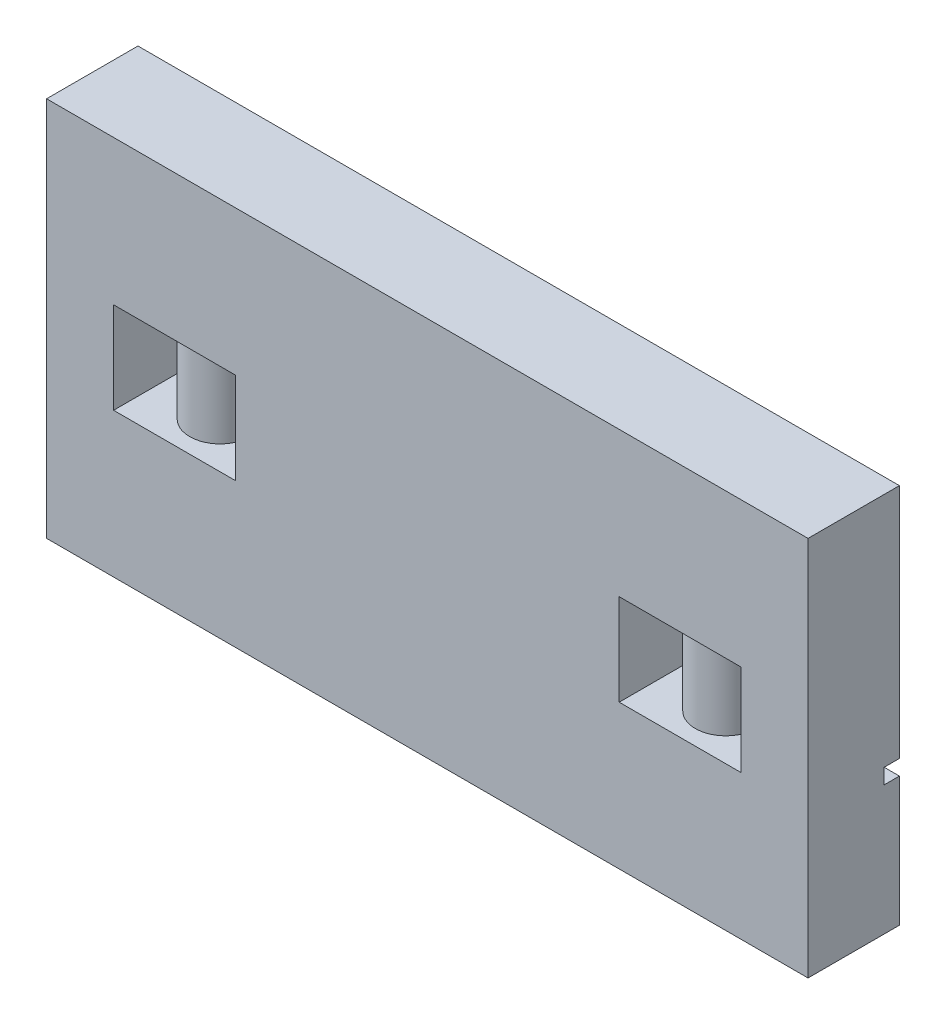
ISO-10303-21;
HEADER;
FILE_DESCRIPTION(('STEP AP214'),'2;1');
FILE_NAME('part.step','',(''),(''),'','','');
FILE_SCHEMA(('AUTOMOTIVE_DESIGN { 1 0 10303 214 1 1 1 1 }'));
ENDSEC;
DATA;
#1=APPLICATION_CONTEXT('core data for automotive mechanical design processes');
#2=APPLICATION_PROTOCOL_DEFINITION('international standard','automotive_design',2000,#1);
#3=PRODUCT_CONTEXT('',#1,'mechanical');
#4=PRODUCT('Part','Part','',(#3));
#5=PRODUCT_RELATED_PRODUCT_CATEGORY('part','',(#4));
#6=PRODUCT_DEFINITION_FORMATION('','',#4);
#7=PRODUCT_DEFINITION_CONTEXT('part definition',#1,'design');
#8=PRODUCT_DEFINITION('design','',#6,#7);
#9=PRODUCT_DEFINITION_SHAPE('','',#8);
#10=(LENGTH_UNIT() NAMED_UNIT(*) SI_UNIT(.MILLI.,.METRE.));
#11=(NAMED_UNIT(*) PLANE_ANGLE_UNIT() SI_UNIT($,.RADIAN.));
#12=(NAMED_UNIT(*) SI_UNIT($,.STERADIAN.) SOLID_ANGLE_UNIT());
#13=UNCERTAINTY_MEASURE_WITH_UNIT(LENGTH_MEASURE(1.E-05),#10,'distance_accuracy_value','');
#14=(GEOMETRIC_REPRESENTATION_CONTEXT(3) GLOBAL_UNCERTAINTY_ASSIGNED_CONTEXT((#13)) GLOBAL_UNIT_ASSIGNED_CONTEXT((#10,
#11,#12)) REPRESENTATION_CONTEXT('',''));
#15=CARTESIAN_POINT('',(0.,0.,0.));
#16=DIRECTION('',(0.,0.,1.));
#17=DIRECTION('',(1.,0.,0.));
#18=AXIS2_PLACEMENT_3D('',#15,#16,#17);
#19=CARTESIAN_POINT('',(0.,0.,60.));
#20=DIRECTION('',(0.,0.,1.));
#21=DIRECTION('',(1.,0.,0.));
#22=AXIS2_PLACEMENT_3D('',#19,#20,#21);
#23=PLANE('',#22);
#24=DIRECTION('',(0.,-1.,0.));
#25=VECTOR('',#24,1.);
#26=CARTESIAN_POINT('',(0.,250.,60.));
#27=LINE('',#26,#25);
#28=CARTESIAN_POINT('',(0.,250.,60.));
#29=VERTEX_POINT('',#28);
#30=CARTESIAN_POINT('',(0.,0.,60.));
#31=VERTEX_POINT('',#30);
#32=EDGE_CURVE('E289',#29,#31,#27,.T.);
#33=ORIENTED_EDGE('',*,*,#32,.T.);
#34=DIRECTION('',(1.,0.,0.));
#35=VECTOR('',#34,1.);
#36=CARTESIAN_POINT('',(0.,0.,60.));
#37=LINE('',#36,#35);
#38=CARTESIAN_POINT('',(500.,0.,60.));
#39=VERTEX_POINT('',#38);
#40=EDGE_CURVE('E288',#31,#39,#37,.T.);
#41=ORIENTED_EDGE('',*,*,#40,.T.);
#42=DIRECTION('',(0.,1.,0.));
#43=VECTOR('',#42,1.);
#44=CARTESIAN_POINT('',(500.,0.,60.));
#45=LINE('',#44,#43);
#46=CARTESIAN_POINT('',(500.,250.,60.));
#47=VERTEX_POINT('',#46);
#48=EDGE_CURVE('E291',#39,#47,#45,.T.);
#49=ORIENTED_EDGE('',*,*,#48,.T.);
#50=DIRECTION('',(-1.,0.,0.));
#51=VECTOR('',#50,1.);
#52=CARTESIAN_POINT('',(500.,250.,60.));
#53=LINE('',#52,#51);
#54=EDGE_CURVE('E293',#47,#29,#53,.T.);
#55=ORIENTED_EDGE('',*,*,#54,.T.);
#56=EDGE_LOOP('',(#33,#41,#49,#55));
#57=FACE_BOUND('',#56,.T.);
#58=DIRECTION('',(0.,-1.,0.));
#59=VECTOR('',#58,1.);
#60=CARTESIAN_POINT('',(44.,154.842468298091,60.));
#61=LINE('',#60,#59);
#62=CARTESIAN_POINT('',(44.,154.842468298091,60.));
#63=VERTEX_POINT('',#62);
#64=CARTESIAN_POINT('',(44.,94.8424682980915,60.));
#65=VERTEX_POINT('',#64);
#66=EDGE_CURVE('E222',#63,#65,#61,.T.);
#67=ORIENTED_EDGE('',*,*,#66,.F.);
#68=DIRECTION('',(-1.,0.,0.));
#69=VECTOR('',#68,1.);
#70=CARTESIAN_POINT('',(500.,154.842468298091,59.9999999999999));
#71=LINE('',#70,#69);
#72=CARTESIAN_POINT('',(124.,154.842468298091,60.));
#73=VERTEX_POINT('',#72);
#74=EDGE_CURVE('E237',#73,#63,#71,.T.);
#75=ORIENTED_EDGE('',*,*,#74,.F.);
#76=DIRECTION('',(0.,-1.,0.));
#77=VECTOR('',#76,1.);
#78=CARTESIAN_POINT('',(124.,154.842468298091,60.));
#79=LINE('',#78,#77);
#80=CARTESIAN_POINT('',(124.,94.8424682980915,60.));
#81=VERTEX_POINT('',#80);
#82=EDGE_CURVE('E229',#73,#81,#79,.T.);
#83=ORIENTED_EDGE('',*,*,#82,.T.);
#84=DIRECTION('',(-1.,0.,0.));
#85=VECTOR('',#84,1.);
#86=CARTESIAN_POINT('',(500.,94.8424682980915,59.9999999999999));
#87=LINE('',#86,#85);
#88=EDGE_CURVE('E234',#81,#65,#87,.T.);
#89=ORIENTED_EDGE('',*,*,#88,.T.);
#90=EDGE_LOOP('',(#67,#75,#83,#89));
#91=FACE_BOUND('',#90,.T.);
#92=DIRECTION('',(0.,-1.,0.));
#93=VECTOR('',#92,1.);
#94=CARTESIAN_POINT('',(376.,154.842468298091,60.));
#95=LINE('',#94,#93);
#96=CARTESIAN_POINT('',(376.,154.842468298091,60.));
#97=VERTEX_POINT('',#96);
#98=CARTESIAN_POINT('',(376.,94.8424682980915,60.));
#99=VERTEX_POINT('',#98);
#100=EDGE_CURVE('E212',#97,#99,#95,.T.);
#101=ORIENTED_EDGE('',*,*,#100,.F.);
#102=DIRECTION('',(-1.,0.,0.));
#103=VECTOR('',#102,1.);
#104=CARTESIAN_POINT('',(500.,154.842468298091,60.));
#105=LINE('',#104,#103);
#106=CARTESIAN_POINT('',(456.,154.842468298091,60.));
#107=VERTEX_POINT('',#106);
#108=EDGE_CURVE('E186',#107,#97,#105,.T.);
#109=ORIENTED_EDGE('',*,*,#108,.F.);
#110=DIRECTION('',(0.,-1.,0.));
#111=VECTOR('',#110,1.);
#112=CARTESIAN_POINT('',(456.,154.842468298091,60.));
#113=LINE('',#112,#111);
#114=CARTESIAN_POINT('',(456.,94.8424682980915,60.));
#115=VERTEX_POINT('',#114);
#116=EDGE_CURVE('E220',#107,#115,#113,.T.);
#117=ORIENTED_EDGE('',*,*,#116,.T.);
#118=DIRECTION('',(-1.,0.,0.));
#119=VECTOR('',#118,1.);
#120=CARTESIAN_POINT('',(500.,94.8424682980915,60.0000000000001));
#121=LINE('',#120,#119);
#122=EDGE_CURVE('E197',#115,#99,#121,.T.);
#123=ORIENTED_EDGE('',*,*,#122,.T.);
#124=EDGE_LOOP('',(#101,#109,#117,#123));
#125=FACE_BOUND('',#124,.T.);
#126=ADVANCED_FACE('F43',(#57,#91,#125),#23,.T.);
#127=CARTESIAN_POINT('',(500.,94.8424682980915,0.));
#128=DIRECTION('',(0.,-1.,0.));
#129=DIRECTION('',(0.,0.,-1.));
#130=AXIS2_PLACEMENT_3D('',#127,#128,#129);
#131=PLANE('',#130);
#132=DIRECTION('',(0.,0.,-1.));
#133=VECTOR('',#132,1.);
#134=CARTESIAN_POINT('',(376.,94.8424682980915,0.));
#135=LINE('',#134,#133);
#136=CARTESIAN_POINT('',(376.,94.8424682980915,10.));
#137=VERTEX_POINT('',#136);
#138=CARTESIAN_POINT('',(376.,94.8424682980915,0.));
#139=VERTEX_POINT('',#138);
#140=EDGE_CURVE('E185',#137,#139,#135,.T.);
#141=ORIENTED_EDGE('',*,*,#140,.F.);
#142=DIRECTION('',(-1.,0.,0.));
#143=VECTOR('',#142,1.);
#144=CARTESIAN_POINT('',(500.,94.8424682980915,10.));
#145=LINE('',#144,#143);
#146=CARTESIAN_POINT('',(124.,94.8424682980915,10.));
#147=VERTEX_POINT('',#146);
#148=EDGE_CURVE('E407',#137,#147,#145,.T.);
#149=ORIENTED_EDGE('',*,*,#148,.T.);
#150=DIRECTION('',(0.,0.,1.));
#151=VECTOR('',#150,1.);
#152=CARTESIAN_POINT('',(124.,94.8424682980915,0.));
#153=LINE('',#152,#151);
#154=CARTESIAN_POINT('',(124.,94.8424682980915,0.));
#155=VERTEX_POINT('',#154);
#156=EDGE_CURVE('E240',#155,#147,#153,.T.);
#157=ORIENTED_EDGE('',*,*,#156,.F.);
#158=DIRECTION('',(-1.,0.,0.));
#159=VECTOR('',#158,1.);
#160=CARTESIAN_POINT('',(500.,94.8424682980915,0.));
#161=LINE('',#160,#159);
#162=EDGE_CURVE('E287',#139,#155,#161,.T.);
#163=ORIENTED_EDGE('',*,*,#162,.F.);
#164=EDGE_LOOP('',(#141,#149,#157,#163));
#165=FACE_BOUND('',#164,.T.);
#166=ADVANCED_FACE('F361',(#165),#131,.T.);
#167=DIRECTION('',(0.,0.,1.));
#168=VECTOR('',#167,1.);
#169=CARTESIAN_POINT('',(456.,94.8424682980915,0.));
#170=LINE('',#169,#168);
#171=CARTESIAN_POINT('',(456.,94.8424682980915,0.));
#172=VERTEX_POINT('',#171);
#173=CARTESIAN_POINT('',(456.,94.8424682980915,10.));
#174=VERTEX_POINT('',#173);
#175=EDGE_CURVE('E207',#172,#174,#170,.T.);
#176=ORIENTED_EDGE('',*,*,#175,.F.);
#177=CARTESIAN_POINT('',(500.,94.8424682980915,0.));
#178=VERTEX_POINT('',#177);
#179=EDGE_CURVE('E281',#178,#172,#161,.T.);
#180=ORIENTED_EDGE('',*,*,#179,.F.);
#181=DIRECTION('',(0.,0.,1.));
#182=VECTOR('',#181,1.);
#183=CARTESIAN_POINT('',(500.,94.8424682980915,0.));
#184=LINE('',#183,#182);
#185=CARTESIAN_POINT('',(500.,94.8424682980915,10.));
#186=VERTEX_POINT('',#185);
#187=EDGE_CURVE('E259',#178,#186,#184,.T.);
#188=ORIENTED_EDGE('',*,*,#187,.T.);
#189=EDGE_CURVE('E279',#186,#174,#145,.T.);
#190=ORIENTED_EDGE('',*,*,#189,.T.);
#191=EDGE_LOOP('',(#176,#180,#188,#190));
#192=FACE_BOUND('',#191,.T.);
#193=ADVANCED_FACE('F369',(#192),#131,.T.);
#194=CARTESIAN_POINT('',(0.,250.,60.));
#195=DIRECTION('',(1.,0.,0.));
#196=DIRECTION('',(0.,0.,-1.));
#197=AXIS2_PLACEMENT_3D('',#194,#195,#196);
#198=PLANE('',#197);
#199=DIRECTION('',(0.,0.,1.));
#200=VECTOR('',#199,1.);
#201=CARTESIAN_POINT('',(0.,94.8424682980915,0.));
#202=LINE('',#201,#200);
#203=CARTESIAN_POINT('',(0.,94.8424682980915,0.));
#204=VERTEX_POINT('',#203);
#205=CARTESIAN_POINT('',(0.,94.8424682980915,10.));
#206=VERTEX_POINT('',#205);
#207=EDGE_CURVE('E216',#204,#206,#202,.T.);
#208=ORIENTED_EDGE('',*,*,#207,.T.);
#209=DIRECTION('',(0.,-1.,0.));
#210=VECTOR('',#209,1.);
#211=CARTESIAN_POINT('',(0.,94.8424682980915,10.));
#212=LINE('',#211,#210);
#213=CARTESIAN_POINT('',(0.,84.8424682980915,10.));
#214=VERTEX_POINT('',#213);
#215=EDGE_CURVE('E267',#206,#214,#212,.T.);
#216=ORIENTED_EDGE('',*,*,#215,.T.);
#217=DIRECTION('',(0.,0.,-1.));
#218=VECTOR('',#217,1.);
#219=CARTESIAN_POINT('',(0.,84.8424682980915,10.));
#220=LINE('',#219,#218);
#221=CARTESIAN_POINT('',(0.,84.8424682980915,0.));
#222=VERTEX_POINT('',#221);
#223=EDGE_CURVE('E265',#214,#222,#220,.T.);
#224=ORIENTED_EDGE('',*,*,#223,.T.);
#225=DIRECTION('',(0.,-1.,0.));
#226=VECTOR('',#225,1.);
#227=CARTESIAN_POINT('',(0.,250.,0.));
#228=LINE('',#227,#226);
#229=CARTESIAN_POINT('',(0.,0.,0.));
#230=VERTEX_POINT('',#229);
#231=EDGE_CURVE('E282',#222,#230,#228,.T.);
#232=ORIENTED_EDGE('',*,*,#231,.T.);
#233=DIRECTION('',(0.,0.,-1.));
#234=VECTOR('',#233,1.);
#235=CARTESIAN_POINT('',(0.,0.,60.));
#236=LINE('',#235,#234);
#237=EDGE_CURVE('E11',#31,#230,#236,.T.);
#238=ORIENTED_EDGE('',*,*,#237,.F.);
#239=ORIENTED_EDGE('',*,*,#32,.F.);
#240=DIRECTION('',(0.,0.,-1.));
#241=VECTOR('',#240,1.);
#242=CARTESIAN_POINT('',(0.,250.,60.));
#243=LINE('',#242,#241);
#244=CARTESIAN_POINT('',(0.,250.,0.));
#245=VERTEX_POINT('',#244);
#246=EDGE_CURVE('E300',#29,#245,#243,.T.);
#247=ORIENTED_EDGE('',*,*,#246,.T.);
#248=EDGE_CURVE('E296',#245,#204,#228,.T.);
#249=ORIENTED_EDGE('',*,*,#248,.T.);
#250=EDGE_LOOP('',(#208,#216,#224,#232,#238,#239,#247,#249));
#251=FACE_BOUND('',#250,.T.);
#252=ADVANCED_FACE('F44',(#251),#198,.F.);
#253=CARTESIAN_POINT('',(500.,0.,60.));
#254=DIRECTION('',(-1.,0.,0.));
#255=DIRECTION('',(0.,0.,1.));
#256=AXIS2_PLACEMENT_3D('',#253,#254,#255);
#257=PLANE('',#256);
#258=ORIENTED_EDGE('',*,*,#187,.F.);
#259=DIRECTION('',(0.,1.,0.));
#260=VECTOR('',#259,1.);
#261=CARTESIAN_POINT('',(500.,0.,0.));
#262=LINE('',#261,#260);
#263=CARTESIAN_POINT('',(500.,250.,0.));
#264=VERTEX_POINT('',#263);
#265=EDGE_CURVE('E305',#178,#264,#262,.T.);
#266=ORIENTED_EDGE('',*,*,#265,.T.);
#267=DIRECTION('',(0.,0.,-1.));
#268=VECTOR('',#267,1.);
#269=CARTESIAN_POINT('',(500.,250.,60.));
#270=LINE('',#269,#268);
#271=EDGE_CURVE('E309',#47,#264,#270,.T.);
#272=ORIENTED_EDGE('',*,*,#271,.F.);
#273=ORIENTED_EDGE('',*,*,#48,.F.);
#274=DIRECTION('',(0.,0.,-1.));
#275=VECTOR('',#274,1.);
#276=CARTESIAN_POINT('',(500.,0.,60.));
#277=LINE('',#276,#275);
#278=CARTESIAN_POINT('',(500.,0.,0.));
#279=VERTEX_POINT('',#278);
#280=EDGE_CURVE('E51',#39,#279,#277,.T.);
#281=ORIENTED_EDGE('',*,*,#280,.T.);
#282=CARTESIAN_POINT('',(500.,84.8424682980915,0.));
#283=VERTEX_POINT('',#282);
#284=EDGE_CURVE('E301',#279,#283,#262,.T.);
#285=ORIENTED_EDGE('',*,*,#284,.T.);
#286=DIRECTION('',(0.,0.,-1.));
#287=VECTOR('',#286,1.);
#288=CARTESIAN_POINT('',(500.,84.8424682980915,10.));
#289=LINE('',#288,#287);
#290=CARTESIAN_POINT('',(500.,84.8424682980915,10.));
#291=VERTEX_POINT('',#290);
#292=EDGE_CURVE('E262',#291,#283,#289,.T.);
#293=ORIENTED_EDGE('',*,*,#292,.F.);
#294=DIRECTION('',(0.,-1.,0.));
#295=VECTOR('',#294,1.);
#296=CARTESIAN_POINT('',(500.,94.8424682980915,10.));
#297=LINE('',#296,#295);
#298=EDGE_CURVE('E261',#186,#291,#297,.T.);
#299=ORIENTED_EDGE('',*,*,#298,.F.);
#300=EDGE_LOOP('',(#258,#266,#272,#273,#281,#285,#293,#299));
#301=FACE_BOUND('',#300,.T.);
#302=ADVANCED_FACE('F318',(#301),#257,.F.);
#303=CARTESIAN_POINT('',(0.,0.,0.));
#304=DIRECTION('',(0.,0.,1.));
#305=DIRECTION('',(1.,0.,0.));
#306=AXIS2_PLACEMENT_3D('',#303,#304,#305);
#307=PLANE('',#306);
#308=DIRECTION('',(1.,0.,0.));
#309=VECTOR('',#308,1.);
#310=CARTESIAN_POINT('',(500.,154.842468298091,0.));
#311=LINE('',#310,#309);
#312=CARTESIAN_POINT('',(376.,154.842468298091,0.));
#313=VERTEX_POINT('',#312);
#314=CARTESIAN_POINT('',(456.,154.842468298091,0.));
#315=VERTEX_POINT('',#314);
#316=EDGE_CURVE('E191',#313,#315,#311,.T.);
#317=ORIENTED_EDGE('',*,*,#316,.F.);
#318=DIRECTION('',(0.,-1.,0.));
#319=VECTOR('',#318,1.);
#320=CARTESIAN_POINT('',(376.,154.842468298091,0.));
#321=LINE('',#320,#319);
#322=EDGE_CURVE('E177',#313,#139,#321,.T.);
#323=ORIENTED_EDGE('',*,*,#322,.T.);
#324=ORIENTED_EDGE('',*,*,#162,.T.);
#325=DIRECTION('',(0.,-1.,0.));
#326=VECTOR('',#325,1.);
#327=CARTESIAN_POINT('',(124.,154.842468298091,0.));
#328=LINE('',#327,#326);
#329=CARTESIAN_POINT('',(124.,154.842468298091,0.));
#330=VERTEX_POINT('',#329);
#331=EDGE_CURVE('E230',#330,#155,#328,.T.);
#332=ORIENTED_EDGE('',*,*,#331,.F.);
#333=DIRECTION('',(1.,0.,0.));
#334=VECTOR('',#333,1.);
#335=CARTESIAN_POINT('',(500.,154.842468298091,0.));
#336=LINE('',#335,#334);
#337=CARTESIAN_POINT('',(44.,154.842468298091,0.));
#338=VERTEX_POINT('',#337);
#339=EDGE_CURVE('E242',#338,#330,#336,.T.);
#340=ORIENTED_EDGE('',*,*,#339,.F.);
#341=DIRECTION('',(0.,-1.,0.));
#342=VECTOR('',#341,1.);
#343=CARTESIAN_POINT('',(44.,154.842468298091,0.));
#344=LINE('',#343,#342);
#345=CARTESIAN_POINT('',(44.,94.8424682980915,0.));
#346=VERTEX_POINT('',#345);
#347=EDGE_CURVE('E221',#338,#346,#344,.T.);
#348=ORIENTED_EDGE('',*,*,#347,.T.);
#349=EDGE_CURVE('E283',#346,#204,#161,.T.);
#350=ORIENTED_EDGE('',*,*,#349,.T.);
#351=ORIENTED_EDGE('',*,*,#248,.F.);
#352=DIRECTION('',(-1.,0.,0.));
#353=VECTOR('',#352,1.);
#354=CARTESIAN_POINT('',(500.,250.,0.));
#355=LINE('',#354,#353);
#356=EDGE_CURVE('E292',#264,#245,#355,.T.);
#357=ORIENTED_EDGE('',*,*,#356,.F.);
#358=ORIENTED_EDGE('',*,*,#265,.F.);
#359=ORIENTED_EDGE('',*,*,#179,.T.);
#360=DIRECTION('',(0.,-1.,0.));
#361=VECTOR('',#360,1.);
#362=CARTESIAN_POINT('',(456.,154.842468298091,0.));
#363=LINE('',#362,#361);
#364=EDGE_CURVE('E190',#315,#172,#363,.T.);
#365=ORIENTED_EDGE('',*,*,#364,.F.);
#366=EDGE_LOOP('',(#317,#323,#324,#332,#340,#348,#350,#351,#357,#358,#359,#365));
#367=FACE_BOUND('',#366,.T.);
#368=ADVANCED_FACE('F200',(#367),#307,.F.);
#369=DIRECTION('',(-1.,0.,0.));
#370=VECTOR('',#369,1.);
#371=CARTESIAN_POINT('',(500.,84.8424682980915,0.));
#372=LINE('',#371,#370);
#373=EDGE_CURVE('E266',#283,#222,#372,.T.);
#374=ORIENTED_EDGE('',*,*,#373,.F.);
#375=ORIENTED_EDGE('',*,*,#284,.F.);
#376=DIRECTION('',(1.,0.,0.));
#377=VECTOR('',#376,1.);
#378=CARTESIAN_POINT('',(0.,0.,0.));
#379=LINE('',#378,#377);
#380=EDGE_CURVE('E302',#230,#279,#379,.T.);
#381=ORIENTED_EDGE('',*,*,#380,.F.);
#382=ORIENTED_EDGE('',*,*,#231,.F.);
#383=EDGE_LOOP('',(#374,#375,#381,#382));
#384=FACE_BOUND('',#383,.T.);
#385=ADVANCED_FACE('F324',(#384),#307,.F.);
#386=CARTESIAN_POINT('',(0.,0.,60.));
#387=DIRECTION('',(0.,1.,0.));
#388=DIRECTION('',(0.,0.,1.));
#389=AXIS2_PLACEMENT_3D('',#386,#387,#388);
#390=PLANE('',#389);
#391=ORIENTED_EDGE('',*,*,#380,.T.);
#392=ORIENTED_EDGE('',*,*,#280,.F.);
#393=ORIENTED_EDGE('',*,*,#40,.F.);
#394=ORIENTED_EDGE('',*,*,#237,.T.);
#395=EDGE_LOOP('',(#391,#392,#393,#394));
#396=FACE_BOUND('',#395,.T.);
#397=ADVANCED_FACE('F355',(#396),#390,.F.);
#398=CARTESIAN_POINT('',(500.,250.,60.));
#399=DIRECTION('',(0.,-1.,0.));
#400=DIRECTION('',(0.,0.,-1.));
#401=AXIS2_PLACEMENT_3D('',#398,#399,#400);
#402=PLANE('',#401);
#403=ORIENTED_EDGE('',*,*,#356,.T.);
#404=ORIENTED_EDGE('',*,*,#246,.F.);
#405=ORIENTED_EDGE('',*,*,#54,.F.);
#406=ORIENTED_EDGE('',*,*,#271,.T.);
#407=EDGE_LOOP('',(#403,#404,#405,#406));
#408=FACE_BOUND('',#407,.T.);
#409=ADVANCED_FACE('F350',(#408),#402,.F.);
#410=DIRECTION('',(0.,0.,-1.));
#411=VECTOR('',#410,1.);
#412=CARTESIAN_POINT('',(44.,94.8424682980915,0.));
#413=LINE('',#412,#411);
#414=CARTESIAN_POINT('',(44.,94.8424682980915,10.));
#415=VERTEX_POINT('',#414);
#416=EDGE_CURVE('E238',#415,#346,#413,.T.);
#417=ORIENTED_EDGE('',*,*,#416,.F.);
#418=EDGE_CURVE('E280',#415,#206,#145,.T.);
#419=ORIENTED_EDGE('',*,*,#418,.T.);
#420=ORIENTED_EDGE('',*,*,#207,.F.);
#421=ORIENTED_EDGE('',*,*,#349,.F.);
#422=EDGE_LOOP('',(#417,#419,#420,#421));
#423=FACE_BOUND('',#422,.T.);
#424=ADVANCED_FACE('F359',(#423),#131,.T.);
#425=CARTESIAN_POINT('',(500.,94.8424682980915,10.));
#426=DIRECTION('',(0.,0.,-1.));
#427=DIRECTION('',(-1.,0.,0.));
#428=AXIS2_PLACEMENT_3D('',#425,#426,#427);
#429=PLANE('',#428);
#430=ORIENTED_EDGE('',*,*,#215,.F.);
#431=ORIENTED_EDGE('',*,*,#418,.F.);
#432=CARTESIAN_POINT('',(84.,94.8424682980915,10.));
#433=VERTEX_POINT('',#432);
#434=EDGE_CURVE('E412',#433,#415,#145,.T.);
#435=ORIENTED_EDGE('',*,*,#434,.F.);
#436=EDGE_CURVE('E401',#147,#433,#145,.T.);
#437=ORIENTED_EDGE('',*,*,#436,.F.);
#438=ORIENTED_EDGE('',*,*,#148,.F.);
#439=CARTESIAN_POINT('',(416.,94.8424682980915,10.));
#440=VERTEX_POINT('',#439);
#441=EDGE_CURVE('E414',#440,#137,#145,.T.);
#442=ORIENTED_EDGE('',*,*,#441,.F.);
#443=EDGE_CURVE('E285',#174,#440,#145,.T.);
#444=ORIENTED_EDGE('',*,*,#443,.F.);
#445=ORIENTED_EDGE('',*,*,#189,.F.);
#446=ORIENTED_EDGE('',*,*,#298,.T.);
#447=DIRECTION('',(-1.,0.,0.));
#448=VECTOR('',#447,1.);
#449=CARTESIAN_POINT('',(500.,84.8424682980915,10.));
#450=LINE('',#449,#448);
#451=EDGE_CURVE('E274',#291,#214,#450,.T.);
#452=ORIENTED_EDGE('',*,*,#451,.T.);
#453=EDGE_LOOP('',(#430,#431,#435,#437,#438,#442,#444,#445,#446,#452));
#454=FACE_BOUND('',#453,.T.);
#455=ADVANCED_FACE('F340',(#454),#429,.T.);
#456=CARTESIAN_POINT('',(500.,84.8424682980915,10.));
#457=DIRECTION('',(0.,1.,0.));
#458=DIRECTION('',(0.,0.,1.));
#459=AXIS2_PLACEMENT_3D('',#456,#457,#458);
#460=PLANE('',#459);
#461=ORIENTED_EDGE('',*,*,#223,.F.);
#462=ORIENTED_EDGE('',*,*,#451,.F.);
#463=ORIENTED_EDGE('',*,*,#292,.T.);
#464=ORIENTED_EDGE('',*,*,#373,.T.);
#465=EDGE_LOOP('',(#461,#462,#463,#464));
#466=FACE_BOUND('',#465,.T.);
#467=ADVANCED_FACE('F328',(#466),#460,.T.);
#468=CARTESIAN_POINT('',(124.,154.842468298091,0.));
#469=DIRECTION('',(1.,0.,0.));
#470=DIRECTION('',(0.,0.,-1.));
#471=AXIS2_PLACEMENT_3D('',#468,#469,#470);
#472=PLANE('',#471);
#473=ORIENTED_EDGE('',*,*,#156,.T.);
#474=EDGE_CURVE('E233',#147,#81,#153,.T.);
#475=ORIENTED_EDGE('',*,*,#474,.T.);
#476=ORIENTED_EDGE('',*,*,#82,.F.);
#477=DIRECTION('',(0.,0.,1.));
#478=VECTOR('',#477,1.);
#479=CARTESIAN_POINT('',(124.,154.842468298091,0.));
#480=LINE('',#479,#478);
#481=EDGE_CURVE('E224',#330,#73,#480,.T.);
#482=ORIENTED_EDGE('',*,*,#481,.F.);
#483=ORIENTED_EDGE('',*,*,#331,.T.);
#484=EDGE_LOOP('',(#473,#475,#476,#482,#483));
#485=FACE_BOUND('',#484,.T.);
#486=ADVANCED_FACE('F408',(#485),#472,.F.);
#487=CARTESIAN_POINT('',(44.,154.842468298091,0.));
#488=DIRECTION('',(-1.,0.,0.));
#489=DIRECTION('',(0.,0.,1.));
#490=AXIS2_PLACEMENT_3D('',#487,#488,#489);
#491=PLANE('',#490);
#492=EDGE_CURVE('E67',#65,#415,#413,.T.);
#493=ORIENTED_EDGE('',*,*,#492,.T.);
#494=ORIENTED_EDGE('',*,*,#416,.T.);
#495=ORIENTED_EDGE('',*,*,#347,.F.);
#496=DIRECTION('',(0.,0.,-1.));
#497=VECTOR('',#496,1.);
#498=CARTESIAN_POINT('',(44.,154.842468298091,0.));
#499=LINE('',#498,#497);
#500=EDGE_CURVE('E250',#63,#338,#499,.T.);
#501=ORIENTED_EDGE('',*,*,#500,.F.);
#502=ORIENTED_EDGE('',*,*,#66,.T.);
#503=EDGE_LOOP('',(#493,#494,#495,#501,#502));
#504=FACE_BOUND('',#503,.T.);
#505=ADVANCED_FACE('F395',(#504),#491,.F.);
#506=CARTESIAN_POINT('',(0.,154.842468298091,0.));
#507=DIRECTION('',(0.,-1.,0.));
#508=DIRECTION('',(0.,0.,-1.));
#509=AXIS2_PLACEMENT_3D('',#506,#507,#508);
#510=PLANE('',#509);
#511=CARTESIAN_POINT('',(84.,154.842468298091,30.));
#512=DIRECTION('',(0.,-1.,0.));
#513=DIRECTION('',(0.,0.,-1.));
#514=AXIS2_PLACEMENT_3D('',#511,#512,#513);
#515=CIRCLE('',#514,20.);
#516=CARTESIAN_POINT('',(84.,154.842468298091,9.99999999999998));
#517=VERTEX_POINT('',#516);
#518=EDGE_CURVE('E245',#517,#517,#515,.T.);
#519=ORIENTED_EDGE('',*,*,#518,.F.);
#520=EDGE_LOOP('',(#519));
#521=FACE_BOUND('',#520,.T.);
#522=ORIENTED_EDGE('',*,*,#74,.T.);
#523=ORIENTED_EDGE('',*,*,#500,.T.);
#524=ORIENTED_EDGE('',*,*,#339,.T.);
#525=ORIENTED_EDGE('',*,*,#481,.T.);
#526=EDGE_LOOP('',(#522,#523,#524,#525));
#527=FACE_BOUND('',#526,.T.);
#528=ADVANCED_FACE('F397',(#521,#527),#510,.T.);
#529=CARTESIAN_POINT('',(0.,94.8424682980915,0.));
#530=DIRECTION('',(0.,-1.,0.));
#531=DIRECTION('',(0.,0.,-1.));
#532=AXIS2_PLACEMENT_3D('',#529,#530,#531);
#533=PLANE('',#532);
#534=ORIENTED_EDGE('',*,*,#436,.T.);
#535=CARTESIAN_POINT('',(84.,94.8424682980915,30.));
#536=DIRECTION('',(0.,-1.,0.));
#537=DIRECTION('',(0.,0.,-1.));
#538=AXIS2_PLACEMENT_3D('',#535,#536,#537);
#539=CIRCLE('',#538,20.);
#540=EDGE_CURVE('E251',#433,#433,#539,.T.);
#541=ORIENTED_EDGE('',*,*,#540,.T.);
#542=ORIENTED_EDGE('',*,*,#434,.T.);
#543=ORIENTED_EDGE('',*,*,#492,.F.);
#544=ORIENTED_EDGE('',*,*,#88,.F.);
#545=ORIENTED_EDGE('',*,*,#474,.F.);
#546=EDGE_LOOP('',(#534,#541,#542,#543,#544,#545));
#547=FACE_BOUND('',#546,.T.);
#548=ADVANCED_FACE('F402',(#547),#533,.F.);
#549=CARTESIAN_POINT('',(84.,154.842468298091,30.));
#550=DIRECTION('',(0.,-1.,0.));
#551=DIRECTION('',(0.,0.,-1.));
#552=AXIS2_PLACEMENT_3D('',#549,#550,#551);
#553=CYLINDRICAL_SURFACE('',#552,20.);
#554=ORIENTED_EDGE('',*,*,#518,.T.);
#555=EDGE_LOOP('',(#554));
#556=FACE_BOUND('',#555,.T.);
#557=ORIENTED_EDGE('',*,*,#540,.F.);
#558=EDGE_LOOP('',(#557));
#559=FACE_BOUND('',#558,.T.);
#560=ADVANCED_FACE('F430',(#556,#559),#553,.T.);
#561=CARTESIAN_POINT('',(376.,154.842468298091,0.));
#562=DIRECTION('',(-1.,0.,0.));
#563=DIRECTION('',(0.,0.,1.));
#564=AXIS2_PLACEMENT_3D('',#561,#562,#563);
#565=PLANE('',#564);
#566=EDGE_CURVE('E59',#99,#137,#135,.T.);
#567=ORIENTED_EDGE('',*,*,#566,.T.);
#568=ORIENTED_EDGE('',*,*,#140,.T.);
#569=ORIENTED_EDGE('',*,*,#322,.F.);
#570=DIRECTION('',(0.,0.,-1.));
#571=VECTOR('',#570,1.);
#572=CARTESIAN_POINT('',(376.,154.842468298091,0.));
#573=LINE('',#572,#571);
#574=EDGE_CURVE('E176',#97,#313,#573,.T.);
#575=ORIENTED_EDGE('',*,*,#574,.F.);
#576=ORIENTED_EDGE('',*,*,#100,.T.);
#577=EDGE_LOOP('',(#567,#568,#569,#575,#576));
#578=FACE_BOUND('',#577,.T.);
#579=ADVANCED_FACE('F180',(#578),#565,.F.);
#580=CARTESIAN_POINT('',(456.,154.842468298091,0.));
#581=DIRECTION('',(1.,0.,0.));
#582=DIRECTION('',(0.,0.,-1.));
#583=AXIS2_PLACEMENT_3D('',#580,#581,#582);
#584=PLANE('',#583);
#585=ORIENTED_EDGE('',*,*,#175,.T.);
#586=EDGE_CURVE('E208',#174,#115,#170,.T.);
#587=ORIENTED_EDGE('',*,*,#586,.T.);
#588=ORIENTED_EDGE('',*,*,#116,.F.);
#589=DIRECTION('',(0.,0.,1.));
#590=VECTOR('',#589,1.);
#591=CARTESIAN_POINT('',(456.,154.842468298091,0.));
#592=LINE('',#591,#590);
#593=EDGE_CURVE('E203',#315,#107,#592,.T.);
#594=ORIENTED_EDGE('',*,*,#593,.F.);
#595=ORIENTED_EDGE('',*,*,#364,.T.);
#596=EDGE_LOOP('',(#585,#587,#588,#594,#595));
#597=FACE_BOUND('',#596,.T.);
#598=ADVANCED_FACE('F416',(#597),#584,.F.);
#599=CARTESIAN_POINT('',(0.,154.842468298091,0.));
#600=DIRECTION('',(0.,-1.,0.));
#601=DIRECTION('',(0.,0.,-1.));
#602=AXIS2_PLACEMENT_3D('',#599,#600,#601);
#603=PLANE('',#602);
#604=CARTESIAN_POINT('',(416.,154.842468298091,30.));
#605=DIRECTION('',(0.,-1.,0.));
#606=DIRECTION('',(0.,0.,-1.));
#607=AXIS2_PLACEMENT_3D('',#604,#605,#606);
#608=CIRCLE('',#607,20.);
#609=CARTESIAN_POINT('',(416.,154.842468298091,9.99999999999998));
#610=VERTEX_POINT('',#609);
#611=EDGE_CURVE('E553',#610,#610,#608,.T.);
#612=ORIENTED_EDGE('',*,*,#611,.F.);
#613=EDGE_LOOP('',(#612));
#614=FACE_BOUND('',#613,.T.);
#615=ORIENTED_EDGE('',*,*,#574,.T.);
#616=ORIENTED_EDGE('',*,*,#316,.T.);
#617=ORIENTED_EDGE('',*,*,#593,.T.);
#618=ORIENTED_EDGE('',*,*,#108,.T.);
#619=EDGE_LOOP('',(#615,#616,#617,#618));
#620=FACE_BOUND('',#619,.T.);
#621=ADVANCED_FACE('F194',(#614,#620),#603,.T.);
#622=CARTESIAN_POINT('',(0.,94.8424682980915,0.));
#623=DIRECTION('',(0.,-1.,0.));
#624=DIRECTION('',(0.,0.,-1.));
#625=AXIS2_PLACEMENT_3D('',#622,#623,#624);
#626=PLANE('',#625);
#627=ORIENTED_EDGE('',*,*,#443,.T.);
#628=CARTESIAN_POINT('',(416.,94.8424682980915,30.));
#629=DIRECTION('',(0.,-1.,0.));
#630=DIRECTION('',(0.,0.,-1.));
#631=AXIS2_PLACEMENT_3D('',#628,#629,#630);
#632=CIRCLE('',#631,20.);
#633=EDGE_CURVE('E258',#440,#440,#632,.T.);
#634=ORIENTED_EDGE('',*,*,#633,.T.);
#635=ORIENTED_EDGE('',*,*,#441,.T.);
#636=ORIENTED_EDGE('',*,*,#566,.F.);
#637=ORIENTED_EDGE('',*,*,#122,.F.);
#638=ORIENTED_EDGE('',*,*,#586,.F.);
#639=EDGE_LOOP('',(#627,#634,#635,#636,#637,#638));
#640=FACE_BOUND('',#639,.T.);
#641=ADVANCED_FACE('F418',(#640),#626,.F.);
#642=CARTESIAN_POINT('',(416.,154.842468298091,30.));
#643=DIRECTION('',(0.,-1.,0.));
#644=DIRECTION('',(0.,0.,-1.));
#645=AXIS2_PLACEMENT_3D('',#642,#643,#644);
#646=CYLINDRICAL_SURFACE('',#645,20.);
#647=ORIENTED_EDGE('',*,*,#611,.T.);
#648=EDGE_LOOP('',(#647));
#649=FACE_BOUND('',#648,.T.);
#650=ORIENTED_EDGE('',*,*,#633,.F.);
#651=EDGE_LOOP('',(#650));
#652=FACE_BOUND('',#651,.T.);
#653=ADVANCED_FACE('F537',(#649,#652),#646,.T.);
#654=CLOSED_SHELL('',(#126,#166,#193,#252,#302,#368,#385,#397,#409,#424,#455,#467,#486,#505,
#528,#548,#560,#579,#598,#621,#641,#653));
#655=MANIFOLD_SOLID_BREP('B2',#654);
#656=ADVANCED_BREP_SHAPE_REPRESENTATION('',(#18,#655),#14);
#657=SHAPE_DEFINITION_REPRESENTATION(#9,#656);
ENDSEC;
END-ISO-10303-21;
